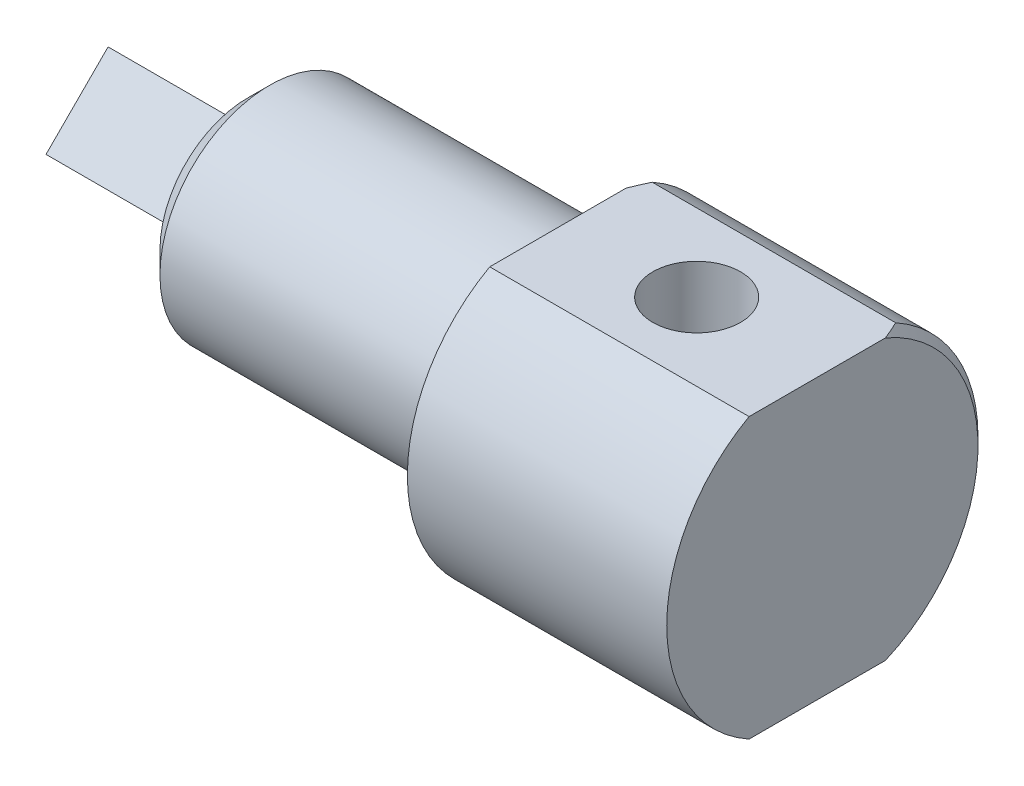
ISO-10303-21;
HEADER;
FILE_DESCRIPTION(('STEP AP214'),'2;1');
FILE_NAME('part.step','',(''),(''),'','','');
FILE_SCHEMA(('AUTOMOTIVE_DESIGN { 1 0 10303 214 1 1 1 1 }'));
ENDSEC;
DATA;
#1=APPLICATION_CONTEXT('core data for automotive mechanical design processes');
#2=APPLICATION_PROTOCOL_DEFINITION('international standard','automotive_design',2000,#1);
#3=PRODUCT_CONTEXT('',#1,'mechanical');
#4=PRODUCT('Part','Part','',(#3));
#5=PRODUCT_RELATED_PRODUCT_CATEGORY('part','',(#4));
#6=PRODUCT_DEFINITION_FORMATION('','',#4);
#7=PRODUCT_DEFINITION_CONTEXT('part definition',#1,'design');
#8=PRODUCT_DEFINITION('design','',#6,#7);
#9=PRODUCT_DEFINITION_SHAPE('','',#8);
#10=(LENGTH_UNIT() NAMED_UNIT(*) SI_UNIT(.MILLI.,.METRE.));
#11=(NAMED_UNIT(*) PLANE_ANGLE_UNIT() SI_UNIT($,.RADIAN.));
#12=(NAMED_UNIT(*) SI_UNIT($,.STERADIAN.) SOLID_ANGLE_UNIT());
#13=UNCERTAINTY_MEASURE_WITH_UNIT(LENGTH_MEASURE(1.E-05),#10,'distance_accuracy_value','');
#14=(GEOMETRIC_REPRESENTATION_CONTEXT(3) GLOBAL_UNCERTAINTY_ASSIGNED_CONTEXT((#13)) GLOBAL_UNIT_ASSIGNED_CONTEXT((#10,
#11,#12)) REPRESENTATION_CONTEXT('',''));
#15=CARTESIAN_POINT('',(0.,0.,0.));
#16=DIRECTION('',(0.,0.,1.));
#17=DIRECTION('',(1.,0.,0.));
#18=AXIS2_PLACEMENT_3D('',#15,#16,#17);
#19=CARTESIAN_POINT('',(0.,0.,0.));
#20=DIRECTION('',(1.,0.,0.));
#21=DIRECTION('',(0.,0.,-1.));
#22=AXIS2_PLACEMENT_3D('',#19,#20,#21);
#23=CYLINDRICAL_SURFACE('',#22,40.);
#24=DIRECTION('',(-1.,0.,0.));
#25=VECTOR('',#24,1.);
#26=CARTESIAN_POINT('',(489.715486354475,-35.,19.3649167310371));
#27=LINE('',#26,#25);
#28=CARTESIAN_POINT('',(145.,-35.,19.3649167310371));
#29=VERTEX_POINT('',#28);
#30=CARTESIAN_POINT('',(80.,-35.,19.3649167310371));
#31=VERTEX_POINT('',#30);
#32=EDGE_CURVE('E141',#29,#31,#27,.T.);
#33=ORIENTED_EDGE('',*,*,#32,.F.);
#34=CARTESIAN_POINT('',(145.,0.,0.));
#35=DIRECTION('',(1.,0.,0.));
#36=DIRECTION('',(0.,0.,-1.));
#37=AXIS2_PLACEMENT_3D('',#34,#35,#36);
#38=CIRCLE('',#37,40.);
#39=CARTESIAN_POINT('',(145.,35.,19.3649167310371));
#40=VERTEX_POINT('',#39);
#41=EDGE_CURVE('E151',#40,#29,#38,.T.);
#42=ORIENTED_EDGE('',*,*,#41,.F.);
#43=DIRECTION('',(-1.,0.,0.));
#44=VECTOR('',#43,1.);
#45=CARTESIAN_POINT('',(592.003645318366,35.,19.3649167310371));
#46=LINE('',#45,#44);
#47=CARTESIAN_POINT('',(80.0000000000002,35.,19.3649167310371));
#48=VERTEX_POINT('',#47);
#49=EDGE_CURVE('E172',#40,#48,#46,.T.);
#50=ORIENTED_EDGE('',*,*,#49,.T.);
#51=CARTESIAN_POINT('',(80.,0.,0.));
#52=DIRECTION('',(1.,0.,0.));
#53=DIRECTION('',(0.,0.,-1.));
#54=AXIS2_PLACEMENT_3D('',#51,#52,#53);
#55=CIRCLE('',#54,40.);
#56=EDGE_CURVE('E157',#48,#31,#55,.T.);
#57=ORIENTED_EDGE('',*,*,#56,.T.);
#58=EDGE_LOOP('',(#33,#42,#50,#57));
#59=FACE_BOUND('',#58,.T.);
#60=ADVANCED_FACE('F35',(#59),#23,.T.);
#61=CARTESIAN_POINT('',(80.,27.5,0.));
#62=DIRECTION('',(-1.,0.,0.));
#63=DIRECTION('',(0.,0.,1.));
#64=AXIS2_PLACEMENT_3D('',#61,#62,#63);
#65=PLANE('',#64);
#66=DIRECTION('',(0.,0.,-1.));
#67=VECTOR('',#66,1.);
#68=CARTESIAN_POINT('',(80.,35.,0.));
#69=LINE('',#68,#67);
#70=CARTESIAN_POINT('',(80.,35.,-14.7986485869487));
#71=VERTEX_POINT('',#70);
#72=EDGE_CURVE('E176',#48,#71,#69,.T.);
#73=ORIENTED_EDGE('',*,*,#72,.T.);
#74=CARTESIAN_POINT('',(80.,0.,0.));
#75=DIRECTION('',(-1.,0.,0.));
#76=DIRECTION('',(0.,0.,1.));
#77=AXIS2_PLACEMENT_3D('',#74,#75,#76);
#78=CIRCLE('',#77,38.);
#79=CARTESIAN_POINT('',(80.,-35.,-14.7986485869488));
#80=VERTEX_POINT('',#79);
#81=EDGE_CURVE('E50',#71,#80,#78,.T.);
#82=ORIENTED_EDGE('',*,*,#81,.T.);
#83=DIRECTION('',(0.,0.,-1.));
#84=VECTOR('',#83,1.);
#85=CARTESIAN_POINT('',(80.,-35.,0.));
#86=LINE('',#85,#84);
#87=EDGE_CURVE('E165',#31,#80,#86,.T.);
#88=ORIENTED_EDGE('',*,*,#87,.F.);
#89=ORIENTED_EDGE('',*,*,#56,.F.);
#90=EDGE_LOOP('',(#73,#82,#88,#89));
#91=FACE_BOUND('',#90,.T.);
#92=CARTESIAN_POINT('',(80.,0.,0.));
#93=DIRECTION('',(1.,0.,0.));
#94=DIRECTION('',(0.,0.,-1.));
#95=AXIS2_PLACEMENT_3D('',#92,#93,#94);
#96=CIRCLE('',#95,27.5);
#97=CARTESIAN_POINT('',(80.,0.,-27.5));
#98=VERTEX_POINT('',#97);
#99=EDGE_CURVE('E233',#98,#98,#96,.T.);
#100=ORIENTED_EDGE('',*,*,#99,.T.);
#101=EDGE_LOOP('',(#100));
#102=FACE_BOUND('',#101,.T.);
#103=ADVANCED_FACE('F301',(#91,#102),#65,.T.);
#104=DIRECTION('',(-1.,0.,0.));
#105=VECTOR('',#104,1.);
#106=CARTESIAN_POINT('',(592.003645318366,35.,-19.3649167310371));
#107=LINE('',#106,#105);
#108=CARTESIAN_POINT('',(143.,35.,-19.3649167310371));
#109=VERTEX_POINT('',#108);
#110=CARTESIAN_POINT('',(82.0000000000002,35.,-19.3649167310371));
#111=VERTEX_POINT('',#110);
#112=EDGE_CURVE('E173',#109,#111,#107,.T.);
#113=ORIENTED_EDGE('',*,*,#112,.F.);
#114=CARTESIAN_POINT('',(143.,0.,0.));
#115=DIRECTION('',(1.,0.,0.));
#116=DIRECTION('',(0.,0.,-1.));
#117=AXIS2_PLACEMENT_3D('',#114,#115,#116);
#118=CIRCLE('',#117,40.);
#119=CARTESIAN_POINT('',(143.,-35.,-19.3649167310371));
#120=VERTEX_POINT('',#119);
#121=EDGE_CURVE('E281',#109,#120,#118,.F.);
#122=ORIENTED_EDGE('',*,*,#121,.T.);
#123=DIRECTION('',(-1.,0.,0.));
#124=VECTOR('',#123,1.);
#125=CARTESIAN_POINT('',(489.715486354475,-35.,-19.3649167310371));
#126=LINE('',#125,#124);
#127=CARTESIAN_POINT('',(82.,-35.,-19.3649167310371));
#128=VERTEX_POINT('',#127);
#129=EDGE_CURVE('E162',#120,#128,#126,.T.);
#130=ORIENTED_EDGE('',*,*,#129,.T.);
#131=CARTESIAN_POINT('',(82.,0.,0.));
#132=DIRECTION('',(-1.,0.,0.));
#133=DIRECTION('',(0.,0.,1.));
#134=AXIS2_PLACEMENT_3D('',#131,#132,#133);
#135=CIRCLE('',#134,40.);
#136=EDGE_CURVE('E319',#128,#111,#135,.F.);
#137=ORIENTED_EDGE('',*,*,#136,.T.);
#138=EDGE_LOOP('',(#113,#122,#130,#137));
#139=FACE_BOUND('',#138,.T.);
#140=ADVANCED_FACE('F303',(#139),#23,.T.);
#141=CARTESIAN_POINT('',(145.,40.,0.));
#142=DIRECTION('',(1.,0.,0.));
#143=DIRECTION('',(0.,0.,-1.));
#144=AXIS2_PLACEMENT_3D('',#141,#142,#143);
#145=PLANE('',#144);
#146=DIRECTION('',(0.,0.,1.));
#147=VECTOR('',#146,1.);
#148=CARTESIAN_POINT('',(145.,-35.,0.));
#149=LINE('',#148,#147);
#150=CARTESIAN_POINT('',(145.,-35.,-14.7986485869487));
#151=VERTEX_POINT('',#150);
#152=EDGE_CURVE('E137',#151,#29,#149,.T.);
#153=ORIENTED_EDGE('',*,*,#152,.F.);
#154=CARTESIAN_POINT('',(145.,0.,0.));
#155=DIRECTION('',(1.,0.,0.));
#156=DIRECTION('',(0.,0.,-1.));
#157=AXIS2_PLACEMENT_3D('',#154,#155,#156);
#158=CIRCLE('',#157,38.);
#159=CARTESIAN_POINT('',(145.,35.,-14.7986485869487));
#160=VERTEX_POINT('',#159);
#161=EDGE_CURVE('E147',#151,#160,#158,.T.);
#162=ORIENTED_EDGE('',*,*,#161,.T.);
#163=DIRECTION('',(0.,0.,1.));
#164=VECTOR('',#163,1.);
#165=CARTESIAN_POINT('',(145.,35.,0.));
#166=LINE('',#165,#164);
#167=EDGE_CURVE('E148',#160,#40,#166,.T.);
#168=ORIENTED_EDGE('',*,*,#167,.T.);
#169=ORIENTED_EDGE('',*,*,#41,.T.);
#170=EDGE_LOOP('',(#153,#162,#168,#169));
#171=FACE_BOUND('',#170,.T.);
#172=ADVANCED_FACE('F152',(#171),#145,.T.);
#173=CARTESIAN_POINT('',(0.,0.,0.));
#174=DIRECTION('',(1.,0.,0.));
#175=DIRECTION('',(0.,0.,-1.));
#176=AXIS2_PLACEMENT_3D('',#173,#174,#175);
#177=CYLINDRICAL_SURFACE('',#176,27.5);
#178=CARTESIAN_POINT('',(5.50000000000003,0.,0.));
#179=DIRECTION('',(-1.,0.,0.));
#180=DIRECTION('',(0.,0.,1.));
#181=AXIS2_PLACEMENT_3D('',#178,#179,#180);
#182=CIRCLE('',#181,27.5);
#183=CARTESIAN_POINT('',(5.50000000000003,0.,27.5));
#184=VERTEX_POINT('',#183);
#185=EDGE_CURVE('E43',#184,#184,#182,.F.);
#186=ORIENTED_EDGE('',*,*,#185,.T.);
#187=EDGE_LOOP('',(#186));
#188=FACE_BOUND('',#187,.T.);
#189=ORIENTED_EDGE('',*,*,#99,.F.);
#190=EDGE_LOOP('',(#189));
#191=FACE_BOUND('',#190,.T.);
#192=CARTESIAN_POINT('',(15.,0.,0.));
#193=DIRECTION('',(-1.,0.,0.));
#194=DIRECTION('',(0.,0.,1.));
#195=AXIS2_PLACEMENT_3D('',#192,#193,#194);
#196=CIRCLE('',#195,27.5);
#197=CARTESIAN_POINT('',(15.,-8.,-26.3106442338457));
#198=VERTEX_POINT('',#197);
#199=CARTESIAN_POINT('',(15.,8.,-26.3106442338457));
#200=VERTEX_POINT('',#199);
#201=EDGE_CURVE('E240',#198,#200,#196,.F.);
#202=ORIENTED_EDGE('',*,*,#201,.F.);
#203=DIRECTION('',(1.,0.,0.));
#204=VECTOR('',#203,1.);
#205=CARTESIAN_POINT('',(0.,-8.,-26.3106442338457));
#206=LINE('',#205,#204);
#207=CARTESIAN_POINT('',(60.,-8.,-26.3106442338457));
#208=VERTEX_POINT('',#207);
#209=EDGE_CURVE('E243',#198,#208,#206,.T.);
#210=ORIENTED_EDGE('',*,*,#209,.T.);
#211=CARTESIAN_POINT('',(60.,0.,0.));
#212=DIRECTION('',(1.,0.,0.));
#213=DIRECTION('',(0.,0.,-1.));
#214=AXIS2_PLACEMENT_3D('',#211,#212,#213);
#215=CIRCLE('',#214,27.5);
#216=CARTESIAN_POINT('',(60.,8.,-26.3106442338457));
#217=VERTEX_POINT('',#216);
#218=EDGE_CURVE('E238',#217,#208,#215,.F.);
#219=ORIENTED_EDGE('',*,*,#218,.F.);
#220=DIRECTION('',(1.,0.,0.));
#221=VECTOR('',#220,1.);
#222=CARTESIAN_POINT('',(0.,8.,-26.3106442338457));
#223=LINE('',#222,#221);
#224=EDGE_CURVE('E236',#200,#217,#223,.T.);
#225=ORIENTED_EDGE('',*,*,#224,.F.);
#226=EDGE_LOOP('',(#202,#210,#219,#225));
#227=FACE_BOUND('',#226,.T.);
#228=ADVANCED_FACE('F314',(#188,#191,#227),#177,.T.);
#229=CARTESIAN_POINT('',(0.,0.,0.));
#230=DIRECTION('',(-1.,0.,0.));
#231=DIRECTION('',(0.,0.,1.));
#232=AXIS2_PLACEMENT_3D('',#229,#230,#231);
#233=PLANE('',#232);
#234=CARTESIAN_POINT('',(0.,0.,0.));
#235=DIRECTION('',(-1.,0.,0.));
#236=DIRECTION('',(0.,0.,1.));
#237=AXIS2_PLACEMENT_3D('',#234,#235,#236);
#238=CIRCLE('',#237,22.);
#239=CARTESIAN_POINT('',(0.,0.,22.));
#240=VERTEX_POINT('',#239);
#241=EDGE_CURVE('E11',#240,#240,#238,.T.);
#242=ORIENTED_EDGE('',*,*,#241,.T.);
#243=EDGE_LOOP('',(#242));
#244=FACE_BOUND('',#243,.T.);
#245=DIRECTION('',(0.,0.707106781186548,0.707106781186547));
#246=VECTOR('',#245,1.);
#247=CARTESIAN_POINT('',(0.,-15.556349186104,0.));
#248=LINE('',#247,#246);
#249=CARTESIAN_POINT('',(0.,-15.556349186104,0.));
#250=VERTEX_POINT('',#249);
#251=CARTESIAN_POINT('',(0.,0.,15.556349186104));
#252=VERTEX_POINT('',#251);
#253=EDGE_CURVE('E198',#250,#252,#248,.T.);
#254=ORIENTED_EDGE('',*,*,#253,.F.);
#255=DIRECTION('',(0.,-0.707106781186547,0.707106781186548));
#256=VECTOR('',#255,1.);
#257=CARTESIAN_POINT('',(0.,-15.556349186104,0.));
#258=LINE('',#257,#256);
#259=CARTESIAN_POINT('',(0.,0.,-15.556349186104));
#260=VERTEX_POINT('',#259);
#261=EDGE_CURVE('E205',#260,#250,#258,.T.);
#262=ORIENTED_EDGE('',*,*,#261,.F.);
#263=DIRECTION('',(0.,-0.707106781186548,-0.707106781186548));
#264=VECTOR('',#263,1.);
#265=CARTESIAN_POINT('',(0.,0.,-15.556349186104));
#266=LINE('',#265,#264);
#267=CARTESIAN_POINT('',(0.,15.5563491861041,0.));
#268=VERTEX_POINT('',#267);
#269=EDGE_CURVE('E217',#268,#260,#266,.T.);
#270=ORIENTED_EDGE('',*,*,#269,.F.);
#271=DIRECTION('',(0.,0.707106781186547,-0.707106781186548));
#272=VECTOR('',#271,1.);
#273=CARTESIAN_POINT('',(0.,0.,15.556349186104));
#274=LINE('',#273,#272);
#275=EDGE_CURVE('E214',#252,#268,#274,.T.);
#276=ORIENTED_EDGE('',*,*,#275,.F.);
#277=EDGE_LOOP('',(#254,#262,#270,#276));
#278=FACE_BOUND('',#277,.T.);
#279=ADVANCED_FACE('F333',(#244,#278),#233,.T.);
#280=CARTESIAN_POINT('',(-35.,-15.556349186104,0.));
#281=DIRECTION('',(0.,0.707106781186548,-0.707106781186548));
#282=DIRECTION('',(0.,0.707106781186548,0.707106781186547));
#283=AXIS2_PLACEMENT_3D('',#280,#281,#282);
#284=PLANE('',#283);
#285=ORIENTED_EDGE('',*,*,#253,.T.);
#286=DIRECTION('',(1.,0.,0.));
#287=VECTOR('',#286,1.);
#288=CARTESIAN_POINT('',(-35.,0.,15.556349186104));
#289=LINE('',#288,#287);
#290=CARTESIAN_POINT('',(-35.,0.,15.556349186104));
#291=VERTEX_POINT('',#290);
#292=EDGE_CURVE('E158',#291,#252,#289,.T.);
#293=ORIENTED_EDGE('',*,*,#292,.F.);
#294=DIRECTION('',(0.,0.707106781186548,0.707106781186547));
#295=VECTOR('',#294,1.);
#296=CARTESIAN_POINT('',(-35.,-15.556349186104,0.));
#297=LINE('',#296,#295);
#298=CARTESIAN_POINT('',(-35.,-15.556349186104,0.));
#299=VERTEX_POINT('',#298);
#300=EDGE_CURVE('E201',#299,#291,#297,.T.);
#301=ORIENTED_EDGE('',*,*,#300,.F.);
#302=DIRECTION('',(1.,0.,0.));
#303=VECTOR('',#302,1.);
#304=CARTESIAN_POINT('',(-35.,-15.556349186104,0.));
#305=LINE('',#304,#303);
#306=EDGE_CURVE('E211',#299,#250,#305,.T.);
#307=ORIENTED_EDGE('',*,*,#306,.T.);
#308=EDGE_LOOP('',(#285,#293,#301,#307));
#309=FACE_BOUND('',#308,.T.);
#310=ADVANCED_FACE('F336',(#309),#284,.F.);
#311=CARTESIAN_POINT('',(-35.,0.,15.556349186104));
#312=DIRECTION('',(0.,-0.707106781186548,-0.707106781186547));
#313=DIRECTION('',(0.,0.707106781186547,-0.707106781186548));
#314=AXIS2_PLACEMENT_3D('',#311,#312,#313);
#315=PLANE('',#314);
#316=ORIENTED_EDGE('',*,*,#275,.T.);
#317=DIRECTION('',(1.,0.,0.));
#318=VECTOR('',#317,1.);
#319=CARTESIAN_POINT('',(-35.,15.5563491861041,0.));
#320=LINE('',#319,#318);
#321=CARTESIAN_POINT('',(-35.,15.5563491861041,0.));
#322=VERTEX_POINT('',#321);
#323=EDGE_CURVE('E227',#322,#268,#320,.T.);
#324=ORIENTED_EDGE('',*,*,#323,.F.);
#325=DIRECTION('',(0.,0.707106781186547,-0.707106781186548));
#326=VECTOR('',#325,1.);
#327=CARTESIAN_POINT('',(-35.,0.,15.556349186104));
#328=LINE('',#327,#326);
#329=EDGE_CURVE('E204',#291,#322,#328,.T.);
#330=ORIENTED_EDGE('',*,*,#329,.F.);
#331=ORIENTED_EDGE('',*,*,#292,.T.);
#332=EDGE_LOOP('',(#316,#324,#330,#331));
#333=FACE_BOUND('',#332,.T.);
#334=ADVANCED_FACE('F352',(#333),#315,.F.);
#335=CARTESIAN_POINT('',(-35.,0.,-15.556349186104));
#336=DIRECTION('',(0.,-0.707106781186548,0.707106781186548));
#337=DIRECTION('',(0.,-0.707106781186548,-0.707106781186548));
#338=AXIS2_PLACEMENT_3D('',#335,#336,#337);
#339=PLANE('',#338);
#340=ORIENTED_EDGE('',*,*,#269,.T.);
#341=DIRECTION('',(1.,0.,0.));
#342=VECTOR('',#341,1.);
#343=CARTESIAN_POINT('',(-35.,0.,-15.556349186104));
#344=LINE('',#343,#342);
#345=CARTESIAN_POINT('',(-35.,0.,-15.556349186104));
#346=VERTEX_POINT('',#345);
#347=EDGE_CURVE('E224',#346,#260,#344,.T.);
#348=ORIENTED_EDGE('',*,*,#347,.F.);
#349=DIRECTION('',(0.,-0.707106781186548,-0.707106781186548));
#350=VECTOR('',#349,1.);
#351=CARTESIAN_POINT('',(-35.,0.,-15.556349186104));
#352=LINE('',#351,#350);
#353=EDGE_CURVE('E207',#322,#346,#352,.T.);
#354=ORIENTED_EDGE('',*,*,#353,.F.);
#355=ORIENTED_EDGE('',*,*,#323,.T.);
#356=EDGE_LOOP('',(#340,#348,#354,#355));
#357=FACE_BOUND('',#356,.T.);
#358=ADVANCED_FACE('F350',(#357),#339,.F.);
#359=CARTESIAN_POINT('',(-35.,-15.556349186104,0.));
#360=DIRECTION('',(0.,0.707106781186548,0.707106781186547));
#361=DIRECTION('',(0.,-0.707106781186547,0.707106781186548));
#362=AXIS2_PLACEMENT_3D('',#359,#360,#361);
#363=PLANE('',#362);
#364=ORIENTED_EDGE('',*,*,#261,.T.);
#365=ORIENTED_EDGE('',*,*,#306,.F.);
#366=DIRECTION('',(0.,-0.707106781186547,0.707106781186548));
#367=VECTOR('',#366,1.);
#368=CARTESIAN_POINT('',(-35.,-15.556349186104,0.));
#369=LINE('',#368,#367);
#370=EDGE_CURVE('E209',#346,#299,#369,.T.);
#371=ORIENTED_EDGE('',*,*,#370,.F.);
#372=ORIENTED_EDGE('',*,*,#347,.T.);
#373=EDGE_LOOP('',(#364,#365,#371,#372));
#374=FACE_BOUND('',#373,.T.);
#375=ADVANCED_FACE('F341',(#374),#363,.F.);
#376=CARTESIAN_POINT('',(-35.,0.,0.));
#377=DIRECTION('',(-1.,0.,0.));
#378=DIRECTION('',(0.,0.,1.));
#379=AXIS2_PLACEMENT_3D('',#376,#377,#378);
#380=PLANE('',#379);
#381=ORIENTED_EDGE('',*,*,#300,.T.);
#382=ORIENTED_EDGE('',*,*,#329,.T.);
#383=ORIENTED_EDGE('',*,*,#353,.T.);
#384=ORIENTED_EDGE('',*,*,#370,.T.);
#385=EDGE_LOOP('',(#381,#382,#383,#384));
#386=FACE_BOUND('',#385,.T.);
#387=ADVANCED_FACE('F346',(#386),#380,.T.);
#388=CARTESIAN_POINT('',(15.,-8.,-27.5));
#389=DIRECTION('',(-1.,0.,0.));
#390=DIRECTION('',(0.,0.,1.));
#391=AXIS2_PLACEMENT_3D('',#388,#389,#390);
#392=PLANE('',#391);
#393=DIRECTION('',(0.,0.,1.));
#394=VECTOR('',#393,1.);
#395=CARTESIAN_POINT('',(15.,-8.,-27.5));
#396=LINE('',#395,#394);
#397=CARTESIAN_POINT('',(15.,-8.,-22.5));
#398=VERTEX_POINT('',#397);
#399=EDGE_CURVE('E180',#198,#398,#396,.T.);
#400=ORIENTED_EDGE('',*,*,#399,.F.);
#401=ORIENTED_EDGE('',*,*,#201,.T.);
#402=DIRECTION('',(0.,0.,1.));
#403=VECTOR('',#402,1.);
#404=CARTESIAN_POINT('',(15.,8.,-27.5));
#405=LINE('',#404,#403);
#406=CARTESIAN_POINT('',(15.,8.,-22.5));
#407=VERTEX_POINT('',#406);
#408=EDGE_CURVE('E179',#200,#407,#405,.T.);
#409=ORIENTED_EDGE('',*,*,#408,.T.);
#410=DIRECTION('',(0.,1.,0.));
#411=VECTOR('',#410,1.);
#412=CARTESIAN_POINT('',(15.,-8.,-22.5));
#413=LINE('',#412,#411);
#414=EDGE_CURVE('E189',#398,#407,#413,.T.);
#415=ORIENTED_EDGE('',*,*,#414,.F.);
#416=EDGE_LOOP('',(#400,#401,#409,#415));
#417=FACE_BOUND('',#416,.T.);
#418=ADVANCED_FACE('F366',(#417),#392,.F.);
#419=CARTESIAN_POINT('',(60.,-8.,-27.5));
#420=DIRECTION('',(1.,0.,0.));
#421=DIRECTION('',(0.,0.,-1.));
#422=AXIS2_PLACEMENT_3D('',#419,#420,#421);
#423=PLANE('',#422);
#424=ORIENTED_EDGE('',*,*,#218,.T.);
#425=DIRECTION('',(0.,0.,-1.));
#426=VECTOR('',#425,1.);
#427=CARTESIAN_POINT('',(60.,-8.,-27.5));
#428=LINE('',#427,#426);
#429=CARTESIAN_POINT('',(60.,-8.,-22.5));
#430=VERTEX_POINT('',#429);
#431=EDGE_CURVE('E186',#430,#208,#428,.T.);
#432=ORIENTED_EDGE('',*,*,#431,.F.);
#433=DIRECTION('',(0.,1.,0.));
#434=VECTOR('',#433,1.);
#435=CARTESIAN_POINT('',(60.,-8.,-22.5));
#436=LINE('',#435,#434);
#437=CARTESIAN_POINT('',(60.,8.,-22.5));
#438=VERTEX_POINT('',#437);
#439=EDGE_CURVE('E196',#430,#438,#436,.T.);
#440=ORIENTED_EDGE('',*,*,#439,.T.);
#441=DIRECTION('',(0.,0.,-1.));
#442=VECTOR('',#441,1.);
#443=CARTESIAN_POINT('',(60.,8.,-27.5));
#444=LINE('',#443,#442);
#445=EDGE_CURVE('E183',#438,#217,#444,.T.);
#446=ORIENTED_EDGE('',*,*,#445,.T.);
#447=EDGE_LOOP('',(#424,#432,#440,#446));
#448=FACE_BOUND('',#447,.T.);
#449=ADVANCED_FACE('F369',(#448),#423,.F.);
#450=CARTESIAN_POINT('',(15.,-8.,-22.5));
#451=DIRECTION('',(0.,0.,1.));
#452=DIRECTION('',(1.,0.,0.));
#453=AXIS2_PLACEMENT_3D('',#450,#451,#452);
#454=PLANE('',#453);
#455=DIRECTION('',(1.,0.,0.));
#456=VECTOR('',#455,1.);
#457=CARTESIAN_POINT('',(15.,8.,-22.5));
#458=LINE('',#457,#456);
#459=EDGE_CURVE('E191',#407,#438,#458,.T.);
#460=ORIENTED_EDGE('',*,*,#459,.T.);
#461=ORIENTED_EDGE('',*,*,#439,.F.);
#462=DIRECTION('',(1.,0.,0.));
#463=VECTOR('',#462,1.);
#464=CARTESIAN_POINT('',(15.,-8.,-22.5));
#465=LINE('',#464,#463);
#466=EDGE_CURVE('E182',#398,#430,#465,.T.);
#467=ORIENTED_EDGE('',*,*,#466,.F.);
#468=ORIENTED_EDGE('',*,*,#414,.T.);
#469=EDGE_LOOP('',(#460,#461,#467,#468));
#470=FACE_BOUND('',#469,.T.);
#471=ADVANCED_FACE('F371',(#470),#454,.F.);
#472=CARTESIAN_POINT('',(0.,-8.,0.));
#473=DIRECTION('',(0.,1.,0.));
#474=DIRECTION('',(0.,0.,1.));
#475=AXIS2_PLACEMENT_3D('',#472,#473,#474);
#476=PLANE('',#475);
#477=ORIENTED_EDGE('',*,*,#399,.T.);
#478=ORIENTED_EDGE('',*,*,#466,.T.);
#479=ORIENTED_EDGE('',*,*,#431,.T.);
#480=ORIENTED_EDGE('',*,*,#209,.F.);
#481=EDGE_LOOP('',(#477,#478,#479,#480));
#482=FACE_BOUND('',#481,.T.);
#483=ADVANCED_FACE('F374',(#482),#476,.T.);
#484=CARTESIAN_POINT('',(0.,8.,0.));
#485=DIRECTION('',(0.,1.,0.));
#486=DIRECTION('',(0.,0.,1.));
#487=AXIS2_PLACEMENT_3D('',#484,#485,#486);
#488=PLANE('',#487);
#489=ORIENTED_EDGE('',*,*,#224,.T.);
#490=ORIENTED_EDGE('',*,*,#445,.F.);
#491=ORIENTED_EDGE('',*,*,#459,.F.);
#492=ORIENTED_EDGE('',*,*,#408,.F.);
#493=EDGE_LOOP('',(#489,#490,#491,#492));
#494=FACE_BOUND('',#493,.T.);
#495=ADVANCED_FACE('F379',(#494),#488,.F.);
#496=CARTESIAN_POINT('',(592.003645318366,35.,19.3649167310371));
#497=DIRECTION('',(0.,1.,0.));
#498=DIRECTION('',(0.,0.,1.));
#499=AXIS2_PLACEMENT_3D('',#496,#497,#498);
#500=PLANE('',#499);
#501=CARTESIAN_POINT('',(112.5,35.,0.));
#502=DIRECTION('',(0.,1.,0.));
#503=DIRECTION('',(0.,0.,1.));
#504=AXIS2_PLACEMENT_3D('',#501,#502,#503);
#505=CIRCLE('',#504,11.);
#506=CARTESIAN_POINT('',(112.5,35.,11.));
#507=VERTEX_POINT('',#506);
#508=EDGE_CURVE('E163',#507,#507,#505,.T.);
#509=ORIENTED_EDGE('',*,*,#508,.F.);
#510=EDGE_LOOP('',(#509));
#511=FACE_BOUND('',#510,.T.);
#512=ORIENTED_EDGE('',*,*,#167,.F.);
#513=CARTESIAN_POINT('',(145.,35.,-14.7986485869487));
#514=CARTESIAN_POINT('',(144.849169519311,35.,-15.1859422875163));
#515=CARTESIAN_POINT('',(144.693988290972,35.,-15.571528147454));
#516=CARTESIAN_POINT('',(144.375566531998,35.,-16.3391815817764));
#517=CARTESIAN_POINT('',(144.212329203032,35.,-16.7212504833791));
#518=CARTESIAN_POINT('',(143.878323089944,35.,-17.4820601770437));
#519=CARTESIAN_POINT('',(143.707554554256,35.,-17.8608010783944));
#520=CARTESIAN_POINT('',(143.3589401344,35.,-18.6151946039658));
#521=CARTESIAN_POINT('',(143.181091485514,35.,-18.9908459512693));
#522=CARTESIAN_POINT('',(143.,35.,-19.3649167310371));
#523=B_SPLINE_CURVE_WITH_KNOTS('',3,(#513,#514,#515,#516,#517,#518,#519,#520,#521,#522),
.UNSPECIFIED.,.F.,.F.,(4,2,2,2,4),(0.,1.24683830785545,2.49318502387619,3.7394906567694,
4.98628782779644),.UNSPECIFIED.);
#524=EDGE_CURVE('E255',#160,#109,#523,.T.);
#525=ORIENTED_EDGE('',*,*,#524,.T.);
#526=ORIENTED_EDGE('',*,*,#112,.T.);
#527=CARTESIAN_POINT('',(82.,35.,-19.3649167310371));
#528=CARTESIAN_POINT('',(81.8189085144856,35.,-18.9908459512694));
#529=CARTESIAN_POINT('',(81.6410598656004,35.,-18.6151946039658));
#530=CARTESIAN_POINT('',(81.2924454457437,35.,-17.8608010783945));
#531=CARTESIAN_POINT('',(81.121676910056,35.,-17.4820601770437));
#532=CARTESIAN_POINT('',(80.7876707969675,35.,-16.7212504833791));
#533=CARTESIAN_POINT('',(80.6244334680023,35.,-16.3391815817764));
#534=CARTESIAN_POINT('',(80.3060117090283,35.,-15.571528147454));
#535=CARTESIAN_POINT('',(80.1508304806893,35.,-15.1859422875163));
#536=CARTESIAN_POINT('',(80.,35.,-14.7986485869488));
#537=B_SPLINE_CURVE_WITH_KNOTS('',3,(#527,#528,#529,#530,#531,#532,#533,#534,#535,#536),
.UNSPECIFIED.,.F.,.F.,(4,2,2,2,4),(0.,1.24679717102704,2.49310280392024,3.73944951994099,
4.98628782779643),.UNSPECIFIED.);
#538=EDGE_CURVE('E248',#111,#71,#537,.T.);
#539=ORIENTED_EDGE('',*,*,#538,.T.);
#540=ORIENTED_EDGE('',*,*,#72,.F.);
#541=ORIENTED_EDGE('',*,*,#49,.F.);
#542=EDGE_LOOP('',(#512,#525,#526,#539,#540,#541));
#543=FACE_BOUND('',#542,.T.);
#544=ADVANCED_FACE('F262',(#511,#543),#500,.T.);
#545=CARTESIAN_POINT('',(489.715486354475,-35.,19.3649167310371));
#546=DIRECTION('',(0.,1.,0.));
#547=DIRECTION('',(0.,0.,1.));
#548=AXIS2_PLACEMENT_3D('',#545,#546,#547);
#549=PLANE('',#548);
#550=CARTESIAN_POINT('',(112.5,-35.,0.));
#551=DIRECTION('',(0.,1.,0.));
#552=DIRECTION('',(0.,0.,1.));
#553=AXIS2_PLACEMENT_3D('',#550,#551,#552);
#554=CIRCLE('',#553,11.);
#555=CARTESIAN_POINT('',(112.5,-35.,11.));
#556=VERTEX_POINT('',#555);
#557=EDGE_CURVE('E168',#556,#556,#554,.T.);
#558=ORIENTED_EDGE('',*,*,#557,.T.);
#559=EDGE_LOOP('',(#558));
#560=FACE_BOUND('',#559,.T.);
#561=ORIENTED_EDGE('',*,*,#129,.F.);
#562=CARTESIAN_POINT('',(143.,-35.,-19.3649167310371));
#563=CARTESIAN_POINT('',(143.181091485514,-35.,-18.9908459512694));
#564=CARTESIAN_POINT('',(143.3589401344,-35.,-18.6151946039658));
#565=CARTESIAN_POINT('',(143.707554554256,-35.,-17.8608010783945));
#566=CARTESIAN_POINT('',(143.878323089944,-35.,-17.4820601770437));
#567=CARTESIAN_POINT('',(144.212329203032,-35.,-16.7212504833791));
#568=CARTESIAN_POINT('',(144.375566531998,-35.,-16.3391815817764));
#569=CARTESIAN_POINT('',(144.693988290972,-35.,-15.571528147454));
#570=CARTESIAN_POINT('',(144.849169519311,-35.,-15.1859422875163));
#571=CARTESIAN_POINT('',(145.,-35.,-14.7986485869487));
#572=B_SPLINE_CURVE_WITH_KNOTS('',3,(#562,#563,#564,#565,#566,#567,#568,#569,#570,#571),
.UNSPECIFIED.,.F.,.F.,(4,2,2,2,4),(0.,1.24679717102704,2.49310280392025,3.739449519941,
4.98628782779645),.UNSPECIFIED.);
#573=EDGE_CURVE('E143',#120,#151,#572,.T.);
#574=ORIENTED_EDGE('',*,*,#573,.T.);
#575=ORIENTED_EDGE('',*,*,#152,.T.);
#576=ORIENTED_EDGE('',*,*,#32,.T.);
#577=ORIENTED_EDGE('',*,*,#87,.T.);
#578=CARTESIAN_POINT('',(80.,-35.,-14.7986485869488));
#579=CARTESIAN_POINT('',(80.1508304806893,-35.,-15.1859422875163));
#580=CARTESIAN_POINT('',(80.3060117090283,-35.,-15.571528147454));
#581=CARTESIAN_POINT('',(80.6244334680023,-35.,-16.3391815817764));
#582=CARTESIAN_POINT('',(80.7876707969675,-35.,-16.7212504833791));
#583=CARTESIAN_POINT('',(81.121676910056,-35.,-17.4820601770437));
#584=CARTESIAN_POINT('',(81.2924454457437,-35.,-17.8608010783945));
#585=CARTESIAN_POINT('',(81.6410598656004,-35.,-18.6151946039658));
#586=CARTESIAN_POINT('',(81.8189085144856,-35.,-18.9908459512694));
#587=CARTESIAN_POINT('',(82.,-35.,-19.3649167310371));
#588=B_SPLINE_CURVE_WITH_KNOTS('',3,(#578,#579,#580,#581,#582,#583,#584,#585,#586,#587),
.UNSPECIFIED.,.F.,.F.,(4,2,2,2,4),(0.,1.24683830785544,2.49318502387618,3.73949065676938,
4.98628782779641),.UNSPECIFIED.);
#589=EDGE_CURVE('E57',#80,#128,#588,.T.);
#590=ORIENTED_EDGE('',*,*,#589,.T.);
#591=EDGE_LOOP('',(#561,#574,#575,#576,#577,#590));
#592=FACE_BOUND('',#591,.T.);
#593=ADVANCED_FACE('F139',(#560,#592),#549,.F.);
#594=CARTESIAN_POINT('',(112.5,-35.,0.));
#595=DIRECTION('',(0.,1.,0.));
#596=DIRECTION('',(0.,0.,1.));
#597=AXIS2_PLACEMENT_3D('',#594,#595,#596);
#598=CYLINDRICAL_SURFACE('',#597,11.);
#599=ORIENTED_EDGE('',*,*,#508,.T.);
#600=EDGE_LOOP('',(#599));
#601=FACE_BOUND('',#600,.T.);
#602=ORIENTED_EDGE('',*,*,#557,.F.);
#603=EDGE_LOOP('',(#602));
#604=FACE_BOUND('',#603,.T.);
#605=ADVANCED_FACE('F290',(#601,#604),#598,.F.);
#606=CARTESIAN_POINT('',(145.,0.,0.));
#607=DIRECTION('',(-1.,0.,0.));
#608=DIRECTION('',(0.,0.,1.));
#609=AXIS2_PLACEMENT_3D('',#606,#607,#608);
#610=CONICAL_SURFACE('',#609,38.,0.785398163397448);
#611=ORIENTED_EDGE('',*,*,#573,.F.);
#612=ORIENTED_EDGE('',*,*,#121,.F.);
#613=ORIENTED_EDGE('',*,*,#524,.F.);
#614=ORIENTED_EDGE('',*,*,#161,.F.);
#615=EDGE_LOOP('',(#611,#612,#613,#614));
#616=FACE_BOUND('',#615,.T.);
#617=ADVANCED_FACE('F269',(#616),#610,.T.);
#618=CARTESIAN_POINT('',(82.,0.,0.));
#619=DIRECTION('',(1.,0.,0.));
#620=DIRECTION('',(0.,0.,-1.));
#621=AXIS2_PLACEMENT_3D('',#618,#619,#620);
#622=CONICAL_SURFACE('',#621,40.,0.785398163397455);
#623=ORIENTED_EDGE('',*,*,#589,.F.);
#624=ORIENTED_EDGE('',*,*,#81,.F.);
#625=ORIENTED_EDGE('',*,*,#538,.F.);
#626=ORIENTED_EDGE('',*,*,#136,.F.);
#627=EDGE_LOOP('',(#623,#624,#625,#626));
#628=FACE_BOUND('',#627,.T.);
#629=ADVANCED_FACE('F266',(#628),#622,.T.);
#630=CARTESIAN_POINT('',(5.50000000000003,0.,0.));
#631=DIRECTION('',(1.,0.,0.));
#632=DIRECTION('',(0.,0.,-1.));
#633=AXIS2_PLACEMENT_3D('',#630,#631,#632);
#634=CONICAL_SURFACE('',#633,27.5,0.78539816339745);
#635=ORIENTED_EDGE('',*,*,#241,.F.);
#636=EDGE_LOOP('',(#635));
#637=FACE_BOUND('',#636,.T.);
#638=ORIENTED_EDGE('',*,*,#185,.F.);
#639=EDGE_LOOP('',(#638));
#640=FACE_BOUND('',#639,.T.);
#641=ADVANCED_FACE('F37',(#637,#640),#634,.T.);
#642=CLOSED_SHELL('',(#60,#103,#140,#172,#228,#279,#310,#334,#358,#375,#387,#418,#449,#471,#483,
#495,#544,#593,#605,#617,#629,#641));
#643=MANIFOLD_SOLID_BREP('B2',#642);
#644=ADVANCED_BREP_SHAPE_REPRESENTATION('',(#18,#643),#14);
#645=SHAPE_DEFINITION_REPRESENTATION(#9,#644);
ENDSEC;
END-ISO-10303-21;
